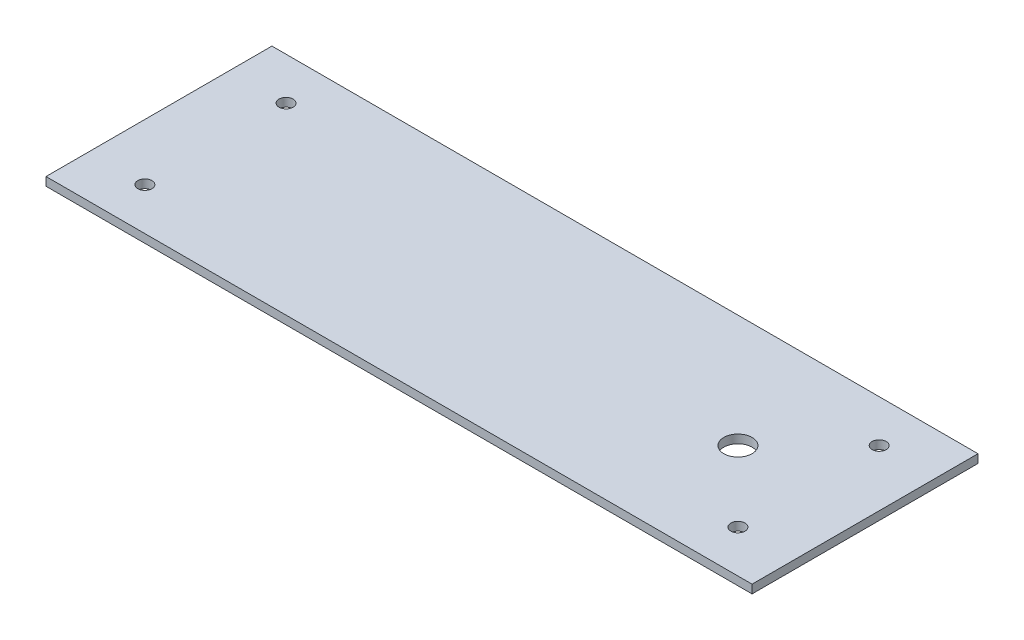
ISO-10303-21;
HEADER;
FILE_DESCRIPTION(('STEP AP214'),'2;1');
FILE_NAME('part.step','',(''),(''),'','','');
FILE_SCHEMA(('AUTOMOTIVE_DESIGN { 1 0 10303 214 1 1 1 1 }'));
ENDSEC;
DATA;
#1=APPLICATION_CONTEXT('core data for automotive mechanical design processes');
#2=APPLICATION_PROTOCOL_DEFINITION('international standard','automotive_design',2000,#1);
#3=PRODUCT_CONTEXT('',#1,'mechanical');
#4=PRODUCT('Part','Part','',(#3));
#5=PRODUCT_RELATED_PRODUCT_CATEGORY('part','',(#4));
#6=PRODUCT_DEFINITION_FORMATION('','',#4);
#7=PRODUCT_DEFINITION_CONTEXT('part definition',#1,'design');
#8=PRODUCT_DEFINITION('design','',#6,#7);
#9=PRODUCT_DEFINITION_SHAPE('','',#8);
#10=(LENGTH_UNIT() NAMED_UNIT(*) SI_UNIT(.MILLI.,.METRE.));
#11=(NAMED_UNIT(*) PLANE_ANGLE_UNIT() SI_UNIT($,.RADIAN.));
#12=(NAMED_UNIT(*) SI_UNIT($,.STERADIAN.) SOLID_ANGLE_UNIT());
#13=UNCERTAINTY_MEASURE_WITH_UNIT(LENGTH_MEASURE(1.E-05),#10,'distance_accuracy_value','');
#14=(GEOMETRIC_REPRESENTATION_CONTEXT(3) GLOBAL_UNCERTAINTY_ASSIGNED_CONTEXT((#13)) GLOBAL_UNIT_ASSIGNED_CONTEXT((#10,
#11,#12)) REPRESENTATION_CONTEXT('',''));
#15=CARTESIAN_POINT('',(0.,0.,0.));
#16=DIRECTION('',(0.,0.,1.));
#17=DIRECTION('',(1.,0.,0.));
#18=AXIS2_PLACEMENT_3D('',#15,#16,#17);
#19=CARTESIAN_POINT('',(0.,3.,0.));
#20=DIRECTION('',(0.,1.,0.));
#21=DIRECTION('',(0.,0.,1.));
#22=AXIS2_PLACEMENT_3D('',#19,#20,#21);
#23=PLANE('',#22);
#24=CARTESIAN_POINT('',(123.521650391388,3.,12.9254539539567));
#25=DIRECTION('',(0.,1.,0.));
#26=DIRECTION('',(0.,0.,1.));
#27=AXIS2_PLACEMENT_3D('',#24,#25,#26);
#28=CIRCLE('',#27,2.49999999999998);
#29=CARTESIAN_POINT('',(123.521650391388,3.,15.4254539539567));
#30=VERTEX_POINT('',#29);
#31=EDGE_CURVE('E127',#30,#30,#28,.T.);
#32=ORIENTED_EDGE('',*,*,#31,.F.);
#33=EDGE_LOOP('',(#32));
#34=FACE_BOUND('',#33,.T.);
#35=CARTESIAN_POINT('',(-86.4783496086118,3.,12.9254539539567));
#36=DIRECTION('',(0.,1.,0.));
#37=DIRECTION('',(0.,0.,1.));
#38=AXIS2_PLACEMENT_3D('',#35,#36,#37);
#39=CIRCLE('',#38,2.50000000000001);
#40=CARTESIAN_POINT('',(-86.4783496086118,3.,15.4254539539567));
#41=VERTEX_POINT('',#40);
#42=EDGE_CURVE('E115',#41,#41,#39,.T.);
#43=ORIENTED_EDGE('',*,*,#42,.F.);
#44=EDGE_LOOP('',(#43));
#45=FACE_BOUND('',#44,.T.);
#46=DIRECTION('',(0.,0.,1.));
#47=VECTOR('',#46,1.);
#48=CARTESIAN_POINT('',(-106.478349608612,3.,-52.0745460460433));
#49=LINE('',#48,#47);
#50=CARTESIAN_POINT('',(-106.478349608612,3.,-52.0745460460433));
#51=VERTEX_POINT('',#50);
#52=CARTESIAN_POINT('',(-106.478349608612,3.,27.9254539539567));
#53=VERTEX_POINT('',#52);
#54=EDGE_CURVE('E85',#51,#53,#49,.T.);
#55=ORIENTED_EDGE('',*,*,#54,.T.);
#56=DIRECTION('',(1.,0.,0.));
#57=VECTOR('',#56,1.);
#58=CARTESIAN_POINT('',(-106.478349608612,3.,27.9254539539567));
#59=LINE('',#58,#57);
#60=CARTESIAN_POINT('',(143.521650391388,3.,27.9254539539567));
#61=VERTEX_POINT('',#60);
#62=EDGE_CURVE('E80',#53,#61,#59,.T.);
#63=ORIENTED_EDGE('',*,*,#62,.T.);
#64=DIRECTION('',(0.,0.,-1.));
#65=VECTOR('',#64,1.);
#66=CARTESIAN_POINT('',(143.521650391388,3.,-52.0745460460433));
#67=LINE('',#66,#65);
#68=CARTESIAN_POINT('',(143.521650391388,3.,-52.0745460460433));
#69=VERTEX_POINT('',#68);
#70=EDGE_CURVE('E83',#61,#69,#67,.T.);
#71=ORIENTED_EDGE('',*,*,#70,.T.);
#72=DIRECTION('',(-1.,0.,0.));
#73=VECTOR('',#72,1.);
#74=CARTESIAN_POINT('',(-106.478349608612,3.,-52.0745460460433));
#75=LINE('',#74,#73);
#76=EDGE_CURVE('E50',#69,#51,#75,.T.);
#77=ORIENTED_EDGE('',*,*,#76,.T.);
#78=EDGE_LOOP('',(#55,#63,#71,#77));
#79=FACE_BOUND('',#78,.T.);
#80=CARTESIAN_POINT('',(-86.4783496086118,3.,-37.0745460460433));
#81=DIRECTION('',(0.,1.,0.));
#82=DIRECTION('',(0.,0.,1.));
#83=AXIS2_PLACEMENT_3D('',#80,#81,#82);
#84=CIRCLE('',#83,2.50000000000001);
#85=CARTESIAN_POINT('',(-86.4783496086118,3.,-34.5745460460433));
#86=VERTEX_POINT('',#85);
#87=EDGE_CURVE('E100',#86,#86,#84,.T.);
#88=ORIENTED_EDGE('',*,*,#87,.F.);
#89=EDGE_LOOP('',(#88));
#90=FACE_BOUND('',#89,.T.);
#91=CARTESIAN_POINT('',(123.521650391388,3.,-37.0745460460433));
#92=DIRECTION('',(0.,1.,0.));
#93=DIRECTION('',(0.,0.,1.));
#94=AXIS2_PLACEMENT_3D('',#91,#92,#93);
#95=CIRCLE('',#94,2.49999999999998);
#96=CARTESIAN_POINT('',(123.521650391388,3.,-34.5745460460433));
#97=VERTEX_POINT('',#96);
#98=EDGE_CURVE('E121',#97,#97,#95,.T.);
#99=ORIENTED_EDGE('',*,*,#98,.F.);
#100=EDGE_LOOP('',(#99));
#101=FACE_BOUND('',#100,.T.);
#102=CARTESIAN_POINT('',(98.5216503913882,3.,-12.0745460460433));
#103=DIRECTION('',(0.,1.,0.));
#104=DIRECTION('',(0.,0.,1.));
#105=AXIS2_PLACEMENT_3D('',#102,#103,#104);
#106=CIRCLE('',#105,5.);
#107=CARTESIAN_POINT('',(98.5216503913882,3.,-7.0745460460433));
#108=VERTEX_POINT('',#107);
#109=EDGE_CURVE('E133',#108,#108,#106,.T.);
#110=ORIENTED_EDGE('',*,*,#109,.F.);
#111=EDGE_LOOP('',(#110));
#112=FACE_BOUND('',#111,.T.);
#113=ADVANCED_FACE('F33',(#34,#45,#79,#90,#101,#112),#23,.T.);
#114=CARTESIAN_POINT('',(0.,0.,0.));
#115=DIRECTION('',(0.,1.,0.));
#116=DIRECTION('',(0.,0.,1.));
#117=AXIS2_PLACEMENT_3D('',#114,#115,#116);
#118=PLANE('',#117);
#119=CARTESIAN_POINT('',(123.521650391388,0.,12.9254539539567));
#120=DIRECTION('',(0.,1.,0.));
#121=DIRECTION('',(0.,0.,1.));
#122=AXIS2_PLACEMENT_3D('',#119,#120,#121);
#123=CIRCLE('',#122,2.49999999999998);
#124=CARTESIAN_POINT('',(123.521650391388,0.,15.4254539539567));
#125=VERTEX_POINT('',#124);
#126=EDGE_CURVE('E130',#125,#125,#123,.T.);
#127=ORIENTED_EDGE('',*,*,#126,.T.);
#128=EDGE_LOOP('',(#127));
#129=FACE_BOUND('',#128,.T.);
#130=CARTESIAN_POINT('',(-86.4783496086118,0.,12.9254539539567));
#131=DIRECTION('',(0.,1.,0.));
#132=DIRECTION('',(0.,0.,1.));
#133=AXIS2_PLACEMENT_3D('',#130,#131,#132);
#134=CIRCLE('',#133,2.50000000000001);
#135=CARTESIAN_POINT('',(-86.4783496086118,0.,15.4254539539567));
#136=VERTEX_POINT('',#135);
#137=EDGE_CURVE('E118',#136,#136,#134,.T.);
#138=ORIENTED_EDGE('',*,*,#137,.T.);
#139=EDGE_LOOP('',(#138));
#140=FACE_BOUND('',#139,.T.);
#141=DIRECTION('',(0.,0.,1.));
#142=VECTOR('',#141,1.);
#143=CARTESIAN_POINT('',(-106.478349608612,0.,-52.0745460460433));
#144=LINE('',#143,#142);
#145=CARTESIAN_POINT('',(-106.478349608612,0.,-52.0745460460433));
#146=VERTEX_POINT('',#145);
#147=CARTESIAN_POINT('',(-106.478349608612,0.,27.9254539539567));
#148=VERTEX_POINT('',#147);
#149=EDGE_CURVE('E97',#146,#148,#144,.T.);
#150=ORIENTED_EDGE('',*,*,#149,.F.);
#151=DIRECTION('',(-1.,0.,0.));
#152=VECTOR('',#151,1.);
#153=CARTESIAN_POINT('',(-106.478349608612,0.,-52.0745460460433));
#154=LINE('',#153,#152);
#155=CARTESIAN_POINT('',(143.521650391388,0.,-52.0745460460433));
#156=VERTEX_POINT('',#155);
#157=EDGE_CURVE('E73',#156,#146,#154,.T.);
#158=ORIENTED_EDGE('',*,*,#157,.F.);
#159=DIRECTION('',(0.,0.,-1.));
#160=VECTOR('',#159,1.);
#161=CARTESIAN_POINT('',(143.521650391388,0.,-52.0745460460433));
#162=LINE('',#161,#160);
#163=CARTESIAN_POINT('',(143.521650391388,0.,27.9254539539567));
#164=VERTEX_POINT('',#163);
#165=EDGE_CURVE('E67',#164,#156,#162,.T.);
#166=ORIENTED_EDGE('',*,*,#165,.F.);
#167=DIRECTION('',(1.,0.,0.));
#168=VECTOR('',#167,1.);
#169=CARTESIAN_POINT('',(-106.478349608612,0.,27.9254539539567));
#170=LINE('',#169,#168);
#171=EDGE_CURVE('E89',#148,#164,#170,.T.);
#172=ORIENTED_EDGE('',*,*,#171,.F.);
#173=EDGE_LOOP('',(#150,#158,#166,#172));
#174=FACE_BOUND('',#173,.T.);
#175=CARTESIAN_POINT('',(-86.4783496086118,0.,-37.0745460460433));
#176=DIRECTION('',(0.,1.,0.));
#177=DIRECTION('',(0.,0.,1.));
#178=AXIS2_PLACEMENT_3D('',#175,#176,#177);
#179=CIRCLE('',#178,2.50000000000001);
#180=CARTESIAN_POINT('',(-86.4783496086118,0.,-34.5745460460433));
#181=VERTEX_POINT('',#180);
#182=EDGE_CURVE('E112',#181,#181,#179,.T.);
#183=ORIENTED_EDGE('',*,*,#182,.T.);
#184=EDGE_LOOP('',(#183));
#185=FACE_BOUND('',#184,.T.);
#186=CARTESIAN_POINT('',(123.521650391388,0.,-37.0745460460433));
#187=DIRECTION('',(0.,1.,0.));
#188=DIRECTION('',(0.,0.,1.));
#189=AXIS2_PLACEMENT_3D('',#186,#187,#188);
#190=CIRCLE('',#189,2.49999999999998);
#191=CARTESIAN_POINT('',(123.521650391388,0.,-34.5745460460433));
#192=VERTEX_POINT('',#191);
#193=EDGE_CURVE('E124',#192,#192,#190,.T.);
#194=ORIENTED_EDGE('',*,*,#193,.T.);
#195=EDGE_LOOP('',(#194));
#196=FACE_BOUND('',#195,.T.);
#197=CARTESIAN_POINT('',(98.5216503913882,0.,-12.0745460460433));
#198=DIRECTION('',(0.,1.,0.));
#199=DIRECTION('',(0.,0.,1.));
#200=AXIS2_PLACEMENT_3D('',#197,#198,#199);
#201=CIRCLE('',#200,5.);
#202=CARTESIAN_POINT('',(98.5216503913882,0.,-7.0745460460433));
#203=VERTEX_POINT('',#202);
#204=EDGE_CURVE('E136',#203,#203,#201,.T.);
#205=ORIENTED_EDGE('',*,*,#204,.T.);
#206=EDGE_LOOP('',(#205));
#207=FACE_BOUND('',#206,.T.);
#208=ADVANCED_FACE('F108',(#129,#140,#174,#185,#196,#207),#118,.F.);
#209=CARTESIAN_POINT('',(-106.478349608612,3.,-52.0745460460433));
#210=DIRECTION('',(1.,0.,0.));
#211=DIRECTION('',(0.,0.,-1.));
#212=AXIS2_PLACEMENT_3D('',#209,#210,#211);
#213=PLANE('',#212);
#214=ORIENTED_EDGE('',*,*,#149,.T.);
#215=DIRECTION('',(0.,-1.,0.));
#216=VECTOR('',#215,1.);
#217=CARTESIAN_POINT('',(-106.478349608612,3.,27.9254539539567));
#218=LINE('',#217,#216);
#219=EDGE_CURVE('E11',#53,#148,#218,.T.);
#220=ORIENTED_EDGE('',*,*,#219,.F.);
#221=ORIENTED_EDGE('',*,*,#54,.F.);
#222=DIRECTION('',(0.,-1.,0.));
#223=VECTOR('',#222,1.);
#224=CARTESIAN_POINT('',(-106.478349608612,3.,-52.0745460460433));
#225=LINE('',#224,#223);
#226=EDGE_CURVE('E93',#51,#146,#225,.T.);
#227=ORIENTED_EDGE('',*,*,#226,.T.);
#228=EDGE_LOOP('',(#214,#220,#221,#227));
#229=FACE_BOUND('',#228,.T.);
#230=ADVANCED_FACE('F35',(#229),#213,.F.);
#231=CARTESIAN_POINT('',(-106.478349608612,3.,27.9254539539567));
#232=DIRECTION('',(0.,0.,-1.));
#233=DIRECTION('',(-1.,0.,0.));
#234=AXIS2_PLACEMENT_3D('',#231,#232,#233);
#235=PLANE('',#234);
#236=ORIENTED_EDGE('',*,*,#171,.T.);
#237=DIRECTION('',(0.,-1.,0.));
#238=VECTOR('',#237,1.);
#239=CARTESIAN_POINT('',(143.521650391388,3.,27.9254539539567));
#240=LINE('',#239,#238);
#241=EDGE_CURVE('E42',#61,#164,#240,.T.);
#242=ORIENTED_EDGE('',*,*,#241,.F.);
#243=ORIENTED_EDGE('',*,*,#62,.F.);
#244=ORIENTED_EDGE('',*,*,#219,.T.);
#245=EDGE_LOOP('',(#236,#242,#243,#244));
#246=FACE_BOUND('',#245,.T.);
#247=ADVANCED_FACE('F88',(#246),#235,.F.);
#248=CARTESIAN_POINT('',(143.521650391388,3.,-52.0745460460433));
#249=DIRECTION('',(-1.,0.,0.));
#250=DIRECTION('',(0.,0.,1.));
#251=AXIS2_PLACEMENT_3D('',#248,#249,#250);
#252=PLANE('',#251);
#253=ORIENTED_EDGE('',*,*,#165,.T.);
#254=DIRECTION('',(0.,-1.,0.));
#255=VECTOR('',#254,1.);
#256=CARTESIAN_POINT('',(143.521650391388,3.,-52.0745460460433));
#257=LINE('',#256,#255);
#258=EDGE_CURVE('E90',#69,#156,#257,.T.);
#259=ORIENTED_EDGE('',*,*,#258,.F.);
#260=ORIENTED_EDGE('',*,*,#70,.F.);
#261=ORIENTED_EDGE('',*,*,#241,.T.);
#262=EDGE_LOOP('',(#253,#259,#260,#261));
#263=FACE_BOUND('',#262,.T.);
#264=ADVANCED_FACE('F91',(#263),#252,.F.);
#265=CARTESIAN_POINT('',(-106.478349608612,3.,-52.0745460460433));
#266=DIRECTION('',(0.,0.,1.));
#267=DIRECTION('',(1.,0.,0.));
#268=AXIS2_PLACEMENT_3D('',#265,#266,#267);
#269=PLANE('',#268);
#270=ORIENTED_EDGE('',*,*,#157,.T.);
#271=ORIENTED_EDGE('',*,*,#226,.F.);
#272=ORIENTED_EDGE('',*,*,#76,.F.);
#273=ORIENTED_EDGE('',*,*,#258,.T.);
#274=EDGE_LOOP('',(#270,#271,#272,#273));
#275=FACE_BOUND('',#274,.T.);
#276=ADVANCED_FACE('F105',(#275),#269,.F.);
#277=CARTESIAN_POINT('',(-86.4783496086118,3.,-37.0745460460433));
#278=DIRECTION('',(0.,-1.,0.));
#279=DIRECTION('',(0.,0.,-1.));
#280=AXIS2_PLACEMENT_3D('',#277,#278,#279);
#281=CYLINDRICAL_SURFACE('',#280,2.50000000000001);
#282=ORIENTED_EDGE('',*,*,#87,.T.);
#283=EDGE_LOOP('',(#282));
#284=FACE_BOUND('',#283,.T.);
#285=ORIENTED_EDGE('',*,*,#182,.F.);
#286=EDGE_LOOP('',(#285));
#287=FACE_BOUND('',#286,.T.);
#288=ADVANCED_FACE('F156',(#284,#287),#281,.F.);
#289=CARTESIAN_POINT('',(-86.4783496086118,3.,12.9254539539567));
#290=DIRECTION('',(0.,-1.,0.));
#291=DIRECTION('',(0.,0.,-1.));
#292=AXIS2_PLACEMENT_3D('',#289,#290,#291);
#293=CYLINDRICAL_SURFACE('',#292,2.50000000000001);
#294=ORIENTED_EDGE('',*,*,#42,.T.);
#295=EDGE_LOOP('',(#294));
#296=FACE_BOUND('',#295,.T.);
#297=ORIENTED_EDGE('',*,*,#137,.F.);
#298=EDGE_LOOP('',(#297));
#299=FACE_BOUND('',#298,.T.);
#300=ADVANCED_FACE('F202',(#296,#299),#293,.F.);
#301=CARTESIAN_POINT('',(123.521650391388,3.,-37.0745460460433));
#302=DIRECTION('',(0.,-1.,0.));
#303=DIRECTION('',(0.,0.,-1.));
#304=AXIS2_PLACEMENT_3D('',#301,#302,#303);
#305=CYLINDRICAL_SURFACE('',#304,2.49999999999998);
#306=ORIENTED_EDGE('',*,*,#98,.T.);
#307=EDGE_LOOP('',(#306));
#308=FACE_BOUND('',#307,.T.);
#309=ORIENTED_EDGE('',*,*,#193,.F.);
#310=EDGE_LOOP('',(#309));
#311=FACE_BOUND('',#310,.T.);
#312=ADVANCED_FACE('F210',(#308,#311),#305,.F.);
#313=CARTESIAN_POINT('',(123.521650391388,3.,12.9254539539567));
#314=DIRECTION('',(0.,-1.,0.));
#315=DIRECTION('',(0.,0.,-1.));
#316=AXIS2_PLACEMENT_3D('',#313,#314,#315);
#317=CYLINDRICAL_SURFACE('',#316,2.49999999999998);
#318=ORIENTED_EDGE('',*,*,#31,.T.);
#319=EDGE_LOOP('',(#318));
#320=FACE_BOUND('',#319,.T.);
#321=ORIENTED_EDGE('',*,*,#126,.F.);
#322=EDGE_LOOP('',(#321));
#323=FACE_BOUND('',#322,.T.);
#324=ADVANCED_FACE('F218',(#320,#323),#317,.F.);
#325=CARTESIAN_POINT('',(98.5216503913882,3.,-12.0745460460433));
#326=DIRECTION('',(0.,-1.,0.));
#327=DIRECTION('',(0.,0.,-1.));
#328=AXIS2_PLACEMENT_3D('',#325,#326,#327);
#329=CYLINDRICAL_SURFACE('',#328,5.);
#330=ORIENTED_EDGE('',*,*,#109,.T.);
#331=EDGE_LOOP('',(#330));
#332=FACE_BOUND('',#331,.T.);
#333=ORIENTED_EDGE('',*,*,#204,.F.);
#334=EDGE_LOOP('',(#333));
#335=FACE_BOUND('',#334,.T.);
#336=ADVANCED_FACE('F142',(#332,#335),#329,.F.);
#337=CLOSED_SHELL('',(#113,#208,#230,#247,#264,#276,#288,#300,#312,#324,#336));
#338=MANIFOLD_SOLID_BREP('B2',#337);
#339=ADVANCED_BREP_SHAPE_REPRESENTATION('',(#18,#338),#14);
#340=SHAPE_DEFINITION_REPRESENTATION(#9,#339);
ENDSEC;
END-ISO-10303-21;
